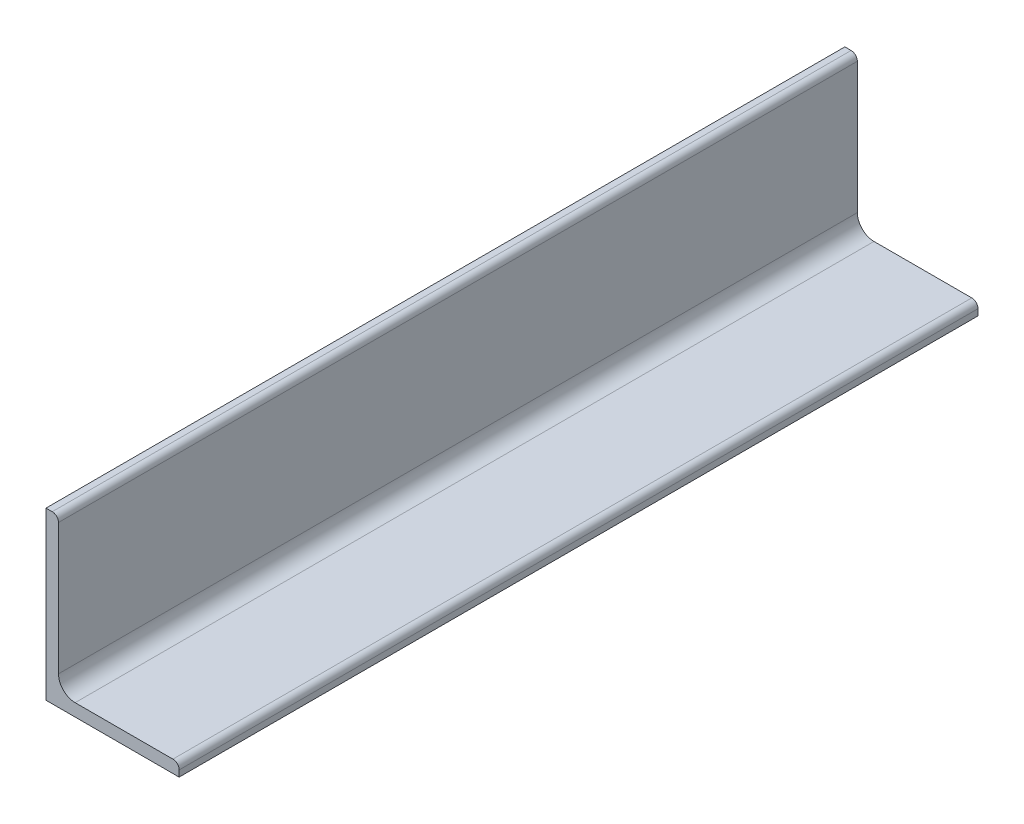
ISO-10303-21;
HEADER;
FILE_DESCRIPTION(('STEP AP214'),'2;1');
FILE_NAME('part.step','',(''),(''),'','','');
FILE_SCHEMA(('AUTOMOTIVE_DESIGN { 1 0 10303 214 1 1 1 1 }'));
ENDSEC;
DATA;
#1=APPLICATION_CONTEXT('core data for automotive mechanical design processes');
#2=APPLICATION_PROTOCOL_DEFINITION('international standard','automotive_design',2000,#1);
#3=PRODUCT_CONTEXT('',#1,'mechanical');
#4=PRODUCT('Part','Part','',(#3));
#5=PRODUCT_RELATED_PRODUCT_CATEGORY('part','',(#4));
#6=PRODUCT_DEFINITION_FORMATION('','',#4);
#7=PRODUCT_DEFINITION_CONTEXT('part definition',#1,'design');
#8=PRODUCT_DEFINITION('design','',#6,#7);
#9=PRODUCT_DEFINITION_SHAPE('','',#8);
#10=(LENGTH_UNIT() NAMED_UNIT(*) SI_UNIT(.MILLI.,.METRE.));
#11=(NAMED_UNIT(*) PLANE_ANGLE_UNIT() SI_UNIT($,.RADIAN.));
#12=(NAMED_UNIT(*) SI_UNIT($,.STERADIAN.) SOLID_ANGLE_UNIT());
#13=UNCERTAINTY_MEASURE_WITH_UNIT(LENGTH_MEASURE(1.E-05),#10,'distance_accuracy_value','');
#14=(GEOMETRIC_REPRESENTATION_CONTEXT(3) GLOBAL_UNCERTAINTY_ASSIGNED_CONTEXT((#13)) GLOBAL_UNIT_ASSIGNED_CONTEXT((#10,
#11,#12)) REPRESENTATION_CONTEXT('',''));
#15=CARTESIAN_POINT('',(0.,0.,0.));
#16=DIRECTION('',(0.,0.,1.));
#17=DIRECTION('',(1.,0.,0.));
#18=AXIS2_PLACEMENT_3D('',#15,#16,#17);
#19=CARTESIAN_POINT('',(0.116507760447575,63.8534276781816,304.8));
#20=DIRECTION('',(1.,0.,0.));
#21=DIRECTION('',(0.,0.,-1.));
#22=AXIS2_PLACEMENT_3D('',#19,#20,#21);
#23=PLANE('',#22);
#24=DIRECTION('',(0.,-1.,0.));
#25=VECTOR('',#24,1.);
#26=CARTESIAN_POINT('',(0.116507760447575,63.8534276781816,0.));
#27=LINE('',#26,#25);
#28=CARTESIAN_POINT('',(0.116507760447575,63.8534276781816,0.));
#29=VERTEX_POINT('',#28);
#30=CARTESIAN_POINT('',(0.116507760447575,0.353427678181561,0.));
#31=VERTEX_POINT('',#30);
#32=EDGE_CURVE('E135',#29,#31,#27,.T.);
#33=ORIENTED_EDGE('',*,*,#32,.T.);
#34=DIRECTION('',(0.,0.,-1.));
#35=VECTOR('',#34,1.);
#36=CARTESIAN_POINT('',(0.116507760447575,0.353427678181561,304.8));
#37=LINE('',#36,#35);
#38=CARTESIAN_POINT('',(0.116507760447575,0.353427678181561,304.8));
#39=VERTEX_POINT('',#38);
#40=EDGE_CURVE('E11',#39,#31,#37,.T.);
#41=ORIENTED_EDGE('',*,*,#40,.F.);
#42=DIRECTION('',(0.,-1.,0.));
#43=VECTOR('',#42,1.);
#44=CARTESIAN_POINT('',(0.116507760447575,63.8534276781816,304.8));
#45=LINE('',#44,#43);
#46=CARTESIAN_POINT('',(0.116507760447575,63.8534276781816,304.8));
#47=VERTEX_POINT('',#46);
#48=EDGE_CURVE('E151',#47,#39,#45,.T.);
#49=ORIENTED_EDGE('',*,*,#48,.F.);
#50=DIRECTION('',(0.,0.,-1.));
#51=VECTOR('',#50,1.);
#52=CARTESIAN_POINT('',(0.116507760447575,63.8534276781816,304.8));
#53=LINE('',#52,#51);
#54=EDGE_CURVE('E131',#47,#29,#53,.T.);
#55=ORIENTED_EDGE('',*,*,#54,.T.);
#56=EDGE_LOOP('',(#33,#41,#49,#55));
#57=FACE_BOUND('',#56,.T.);
#58=ADVANCED_FACE('F33',(#57),#23,.F.);
#59=CARTESIAN_POINT('',(0.116507760447575,0.353427678181561,304.8));
#60=DIRECTION('',(0.,1.,0.));
#61=DIRECTION('',(0.,0.,1.));
#62=AXIS2_PLACEMENT_3D('',#59,#60,#61);
#63=PLANE('',#62);
#64=DIRECTION('',(1.,0.,0.));
#65=VECTOR('',#64,1.);
#66=CARTESIAN_POINT('',(0.116507760447575,0.353427678181561,0.));
#67=LINE('',#66,#65);
#68=CARTESIAN_POINT('',(50.9165077604476,0.353427678181561,0.));
#69=VERTEX_POINT('',#68);
#70=EDGE_CURVE('E138',#31,#69,#67,.T.);
#71=ORIENTED_EDGE('',*,*,#70,.T.);
#72=DIRECTION('',(0.,0.,-1.));
#73=VECTOR('',#72,1.);
#74=CARTESIAN_POINT('',(50.9165077604476,0.353427678181561,304.8));
#75=LINE('',#74,#73);
#76=CARTESIAN_POINT('',(50.9165077604476,0.353427678181561,304.8));
#77=VERTEX_POINT('',#76);
#78=EDGE_CURVE('E41',#77,#69,#75,.T.);
#79=ORIENTED_EDGE('',*,*,#78,.F.);
#80=DIRECTION('',(1.,0.,0.));
#81=VECTOR('',#80,1.);
#82=CARTESIAN_POINT('',(0.116507760447575,0.353427678181561,304.8));
#83=LINE('',#82,#81);
#84=EDGE_CURVE('E95',#39,#77,#83,.T.);
#85=ORIENTED_EDGE('',*,*,#84,.F.);
#86=ORIENTED_EDGE('',*,*,#40,.T.);
#87=EDGE_LOOP('',(#71,#79,#85,#86));
#88=FACE_BOUND('',#87,.T.);
#89=ADVANCED_FACE('F194',(#88),#63,.F.);
#90=CARTESIAN_POINT('',(50.9165077604476,0.353427678181561,304.8));
#91=DIRECTION('',(-1.,0.,0.));
#92=DIRECTION('',(0.,0.,1.));
#93=AXIS2_PLACEMENT_3D('',#90,#91,#92);
#94=PLANE('',#93);
#95=DIRECTION('',(0.,1.,0.));
#96=VECTOR('',#95,1.);
#97=CARTESIAN_POINT('',(50.9165077604476,0.353427678181561,0.));
#98=LINE('',#97,#96);
#99=CARTESIAN_POINT('',(50.9165077604476,2.73467767818156,0.));
#100=VERTEX_POINT('',#99);
#101=EDGE_CURVE('E140',#69,#100,#98,.T.);
#102=ORIENTED_EDGE('',*,*,#101,.T.);
#103=DIRECTION('',(0.,0.,-1.));
#104=VECTOR('',#103,1.);
#105=CARTESIAN_POINT('',(50.9165077604476,2.73467767818156,304.8));
#106=LINE('',#105,#104);
#107=CARTESIAN_POINT('',(50.9165077604476,2.73467767818156,304.8));
#108=VERTEX_POINT('',#107);
#109=EDGE_CURVE('E161',#108,#100,#106,.T.);
#110=ORIENTED_EDGE('',*,*,#109,.F.);
#111=DIRECTION('',(0.,1.,0.));
#112=VECTOR('',#111,1.);
#113=CARTESIAN_POINT('',(50.9165077604476,0.353427678181561,304.8));
#114=LINE('',#113,#112);
#115=EDGE_CURVE('E169',#77,#108,#114,.T.);
#116=ORIENTED_EDGE('',*,*,#115,.F.);
#117=ORIENTED_EDGE('',*,*,#78,.T.);
#118=EDGE_LOOP('',(#102,#110,#116,#117));
#119=FACE_BOUND('',#118,.T.);
#120=ADVANCED_FACE('F167',(#119),#94,.F.);
#121=CARTESIAN_POINT('',(48.5352577604476,2.73467767818156,304.8));
#122=DIRECTION('',(0.,0.,-1.));
#123=DIRECTION('',(-1.,0.,0.));
#124=AXIS2_PLACEMENT_3D('',#121,#122,#123);
#125=CYLINDRICAL_SURFACE('',#124,2.38125);
#126=CARTESIAN_POINT('',(48.5352577604476,2.73467767818156,0.));
#127=DIRECTION('',(0.,0.,1.));
#128=DIRECTION('',(1.,0.,0.));
#129=AXIS2_PLACEMENT_3D('',#126,#127,#128);
#130=CIRCLE('',#129,2.38125);
#131=CARTESIAN_POINT('',(48.5352577604476,5.11592767818156,0.));
#132=VERTEX_POINT('',#131);
#133=EDGE_CURVE('E142',#100,#132,#130,.T.);
#134=ORIENTED_EDGE('',*,*,#133,.T.);
#135=DIRECTION('',(0.,0.,-1.));
#136=VECTOR('',#135,1.);
#137=CARTESIAN_POINT('',(48.5352577604476,5.11592767818156,304.8));
#138=LINE('',#137,#136);
#139=CARTESIAN_POINT('',(48.5352577604476,5.11592767818156,304.8));
#140=VERTEX_POINT('',#139);
#141=EDGE_CURVE('E158',#140,#132,#138,.T.);
#142=ORIENTED_EDGE('',*,*,#141,.F.);
#143=CARTESIAN_POINT('',(48.5352577604476,2.73467767818156,304.8));
#144=DIRECTION('',(0.,0.,1.));
#145=DIRECTION('',(1.,0.,0.));
#146=AXIS2_PLACEMENT_3D('',#143,#144,#145);
#147=CIRCLE('',#146,2.38125);
#148=EDGE_CURVE('E185',#108,#140,#147,.T.);
#149=ORIENTED_EDGE('',*,*,#148,.F.);
#150=ORIENTED_EDGE('',*,*,#109,.T.);
#151=EDGE_LOOP('',(#134,#142,#149,#150));
#152=FACE_BOUND('',#151,.T.);
#153=ADVANCED_FACE('F178',(#152),#125,.T.);
#154=CARTESIAN_POINT('',(48.5352577604476,5.11592767818156,304.8));
#155=DIRECTION('',(0.,-1.,0.));
#156=DIRECTION('',(0.,0.,-1.));
#157=AXIS2_PLACEMENT_3D('',#154,#155,#156);
#158=PLANE('',#157);
#159=DIRECTION('',(-1.,0.,0.));
#160=VECTOR('',#159,1.);
#161=CARTESIAN_POINT('',(48.5352577604476,5.11592767818156,0.));
#162=LINE('',#161,#160);
#163=CARTESIAN_POINT('',(11.2290077604476,5.11592767818156,0.));
#164=VERTEX_POINT('',#163);
#165=EDGE_CURVE('E144',#132,#164,#162,.T.);
#166=ORIENTED_EDGE('',*,*,#165,.T.);
#167=DIRECTION('',(0.,0.,-1.));
#168=VECTOR('',#167,1.);
#169=CARTESIAN_POINT('',(11.2290077604476,5.11592767818156,304.8));
#170=LINE('',#169,#168);
#171=CARTESIAN_POINT('',(11.2290077604476,5.11592767818156,304.8));
#172=VERTEX_POINT('',#171);
#173=EDGE_CURVE('E155',#172,#164,#170,.T.);
#174=ORIENTED_EDGE('',*,*,#173,.F.);
#175=DIRECTION('',(-1.,0.,0.));
#176=VECTOR('',#175,1.);
#177=CARTESIAN_POINT('',(48.5352577604476,5.11592767818156,304.8));
#178=LINE('',#177,#176);
#179=EDGE_CURVE('E184',#140,#172,#178,.T.);
#180=ORIENTED_EDGE('',*,*,#179,.F.);
#181=ORIENTED_EDGE('',*,*,#141,.T.);
#182=EDGE_LOOP('',(#166,#174,#180,#181));
#183=FACE_BOUND('',#182,.T.);
#184=ADVANCED_FACE('F182',(#183),#158,.F.);
#185=CARTESIAN_POINT('',(11.2290077604476,11.4659276781816,304.8));
#186=DIRECTION('',(0.,0.,-1.));
#187=DIRECTION('',(-1.,0.,0.));
#188=AXIS2_PLACEMENT_3D('',#185,#186,#187);
#189=CYLINDRICAL_SURFACE('',#188,6.34999999999999);
#190=CARTESIAN_POINT('',(11.2290077604476,11.4659276781816,0.));
#191=DIRECTION('',(0.,0.,-1.));
#192=DIRECTION('',(1.,0.,0.));
#193=AXIS2_PLACEMENT_3D('',#190,#191,#192);
#194=CIRCLE('',#193,6.34999999999999);
#195=CARTESIAN_POINT('',(4.87900776044758,11.4659276781816,0.));
#196=VERTEX_POINT('',#195);
#197=EDGE_CURVE('E146',#164,#196,#194,.T.);
#198=ORIENTED_EDGE('',*,*,#197,.T.);
#199=DIRECTION('',(0.,0.,-1.));
#200=VECTOR('',#199,1.);
#201=CARTESIAN_POINT('',(4.87900776044758,11.4659276781816,304.8));
#202=LINE('',#201,#200);
#203=CARTESIAN_POINT('',(4.87900776044758,11.4659276781816,304.8));
#204=VERTEX_POINT('',#203);
#205=EDGE_CURVE('E126',#204,#196,#202,.T.);
#206=ORIENTED_EDGE('',*,*,#205,.F.);
#207=CARTESIAN_POINT('',(11.2290077604476,11.4659276781816,304.8));
#208=DIRECTION('',(0.,0.,-1.));
#209=DIRECTION('',(1.,0.,0.));
#210=AXIS2_PLACEMENT_3D('',#207,#208,#209);
#211=CIRCLE('',#210,6.34999999999999);
#212=EDGE_CURVE('E117',#172,#204,#211,.T.);
#213=ORIENTED_EDGE('',*,*,#212,.F.);
#214=ORIENTED_EDGE('',*,*,#173,.T.);
#215=EDGE_LOOP('',(#198,#206,#213,#214));
#216=FACE_BOUND('',#215,.T.);
#217=ADVANCED_FACE('F206',(#216),#189,.F.);
#218=CARTESIAN_POINT('',(4.87900776044758,11.4659276781816,304.8));
#219=DIRECTION('',(-1.,0.,0.));
#220=DIRECTION('',(0.,0.,1.));
#221=AXIS2_PLACEMENT_3D('',#218,#219,#220);
#222=PLANE('',#221);
#223=DIRECTION('',(0.,1.,0.));
#224=VECTOR('',#223,1.);
#225=CARTESIAN_POINT('',(4.87900776044758,11.4659276781816,0.));
#226=LINE('',#225,#224);
#227=CARTESIAN_POINT('',(4.87900776044758,61.4721776781816,0.));
#228=VERTEX_POINT('',#227);
#229=EDGE_CURVE('E125',#196,#228,#226,.T.);
#230=ORIENTED_EDGE('',*,*,#229,.T.);
#231=DIRECTION('',(0.,0.,-1.));
#232=VECTOR('',#231,1.);
#233=CARTESIAN_POINT('',(4.87900776044758,61.4721776781816,304.8));
#234=LINE('',#233,#232);
#235=CARTESIAN_POINT('',(4.87900776044758,61.4721776781816,304.8));
#236=VERTEX_POINT('',#235);
#237=EDGE_CURVE('E122',#236,#228,#234,.T.);
#238=ORIENTED_EDGE('',*,*,#237,.F.);
#239=DIRECTION('',(0.,1.,0.));
#240=VECTOR('',#239,1.);
#241=CARTESIAN_POINT('',(4.87900776044758,11.4659276781816,304.8));
#242=LINE('',#241,#240);
#243=EDGE_CURVE('E111',#204,#236,#242,.T.);
#244=ORIENTED_EDGE('',*,*,#243,.F.);
#245=ORIENTED_EDGE('',*,*,#205,.T.);
#246=EDGE_LOOP('',(#230,#238,#244,#245));
#247=FACE_BOUND('',#246,.T.);
#248=ADVANCED_FACE('F123',(#247),#222,.F.);
#249=CARTESIAN_POINT('',(2.49775776044757,61.4721776781816,304.8));
#250=DIRECTION('',(0.,0.,-1.));
#251=DIRECTION('',(-1.,0.,0.));
#252=AXIS2_PLACEMENT_3D('',#249,#250,#251);
#253=CYLINDRICAL_SURFACE('',#252,2.38125);
#254=CARTESIAN_POINT('',(2.49775776044757,61.4721776781816,0.));
#255=DIRECTION('',(0.,0.,1.));
#256=DIRECTION('',(1.,0.,0.));
#257=AXIS2_PLACEMENT_3D('',#254,#255,#256);
#258=CIRCLE('',#257,2.38125);
#259=CARTESIAN_POINT('',(2.49775776044758,63.8534276781816,0.));
#260=VERTEX_POINT('',#259);
#261=EDGE_CURVE('E81',#228,#260,#258,.T.);
#262=ORIENTED_EDGE('',*,*,#261,.T.);
#263=DIRECTION('',(0.,0.,-1.));
#264=VECTOR('',#263,1.);
#265=CARTESIAN_POINT('',(2.49775776044758,63.8534276781816,304.8));
#266=LINE('',#265,#264);
#267=CARTESIAN_POINT('',(2.49775776044758,63.8534276781816,304.8));
#268=VERTEX_POINT('',#267);
#269=EDGE_CURVE('E127',#268,#260,#266,.T.);
#270=ORIENTED_EDGE('',*,*,#269,.F.);
#271=CARTESIAN_POINT('',(2.49775776044757,61.4721776781816,304.8));
#272=DIRECTION('',(0.,0.,1.));
#273=DIRECTION('',(1.,0.,0.));
#274=AXIS2_PLACEMENT_3D('',#271,#272,#273);
#275=CIRCLE('',#274,2.38125);
#276=EDGE_CURVE('E115',#236,#268,#275,.T.);
#277=ORIENTED_EDGE('',*,*,#276,.F.);
#278=ORIENTED_EDGE('',*,*,#237,.T.);
#279=EDGE_LOOP('',(#262,#270,#277,#278));
#280=FACE_BOUND('',#279,.T.);
#281=ADVANCED_FACE('F129',(#280),#253,.T.);
#282=CARTESIAN_POINT('',(2.49775776044758,63.8534276781816,304.8));
#283=DIRECTION('',(0.,-1.,0.));
#284=DIRECTION('',(0.,0.,-1.));
#285=AXIS2_PLACEMENT_3D('',#282,#283,#284);
#286=PLANE('',#285);
#287=DIRECTION('',(-1.,0.,0.));
#288=VECTOR('',#287,1.);
#289=CARTESIAN_POINT('',(2.49775776044758,63.8534276781816,0.));
#290=LINE('',#289,#288);
#291=EDGE_CURVE('E87',#260,#29,#290,.T.);
#292=ORIENTED_EDGE('',*,*,#291,.T.);
#293=ORIENTED_EDGE('',*,*,#54,.F.);
#294=DIRECTION('',(-1.,0.,0.));
#295=VECTOR('',#294,1.);
#296=CARTESIAN_POINT('',(2.49775776044758,63.8534276781816,304.8));
#297=LINE('',#296,#295);
#298=EDGE_CURVE('E49',#268,#47,#297,.T.);
#299=ORIENTED_EDGE('',*,*,#298,.F.);
#300=ORIENTED_EDGE('',*,*,#269,.T.);
#301=EDGE_LOOP('',(#292,#293,#299,#300));
#302=FACE_BOUND('',#301,.T.);
#303=ADVANCED_FACE('F214',(#302),#286,.F.);
#304=CARTESIAN_POINT('',(48.5352577604476,2.73467767818156,304.8));
#305=DIRECTION('',(0.,0.,1.));
#306=DIRECTION('',(1.,0.,0.));
#307=AXIS2_PLACEMENT_3D('',#304,#305,#306);
#308=PLANE('',#307);
#309=ORIENTED_EDGE('',*,*,#48,.T.);
#310=ORIENTED_EDGE('',*,*,#84,.T.);
#311=ORIENTED_EDGE('',*,*,#115,.T.);
#312=ORIENTED_EDGE('',*,*,#148,.T.);
#313=ORIENTED_EDGE('',*,*,#179,.T.);
#314=ORIENTED_EDGE('',*,*,#212,.T.);
#315=ORIENTED_EDGE('',*,*,#243,.T.);
#316=ORIENTED_EDGE('',*,*,#276,.T.);
#317=ORIENTED_EDGE('',*,*,#298,.T.);
#318=EDGE_LOOP('',(#309,#310,#311,#312,#313,#314,#315,#316,#317));
#319=FACE_BOUND('',#318,.T.);
#320=ADVANCED_FACE('F113',(#319),#308,.T.);
#321=CARTESIAN_POINT('',(48.5352577604476,2.73467767818156,0.));
#322=DIRECTION('',(0.,0.,1.));
#323=DIRECTION('',(1.,0.,0.));
#324=AXIS2_PLACEMENT_3D('',#321,#322,#323);
#325=PLANE('',#324);
#326=ORIENTED_EDGE('',*,*,#32,.F.);
#327=ORIENTED_EDGE('',*,*,#291,.F.);
#328=ORIENTED_EDGE('',*,*,#261,.F.);
#329=ORIENTED_EDGE('',*,*,#229,.F.);
#330=ORIENTED_EDGE('',*,*,#197,.F.);
#331=ORIENTED_EDGE('',*,*,#165,.F.);
#332=ORIENTED_EDGE('',*,*,#133,.F.);
#333=ORIENTED_EDGE('',*,*,#101,.F.);
#334=ORIENTED_EDGE('',*,*,#70,.F.);
#335=EDGE_LOOP('',(#326,#327,#328,#329,#330,#331,#332,#333,#334));
#336=FACE_BOUND('',#335,.T.);
#337=ADVANCED_FACE('F173',(#336),#325,.F.);
#338=CLOSED_SHELL('',(#58,#89,#120,#153,#184,#217,#248,#281,#303,#320,#337));
#339=MANIFOLD_SOLID_BREP('B2',#338);
#340=ADVANCED_BREP_SHAPE_REPRESENTATION('',(#18,#339),#14);
#341=SHAPE_DEFINITION_REPRESENTATION(#9,#340);
ENDSEC;
END-ISO-10303-21;
